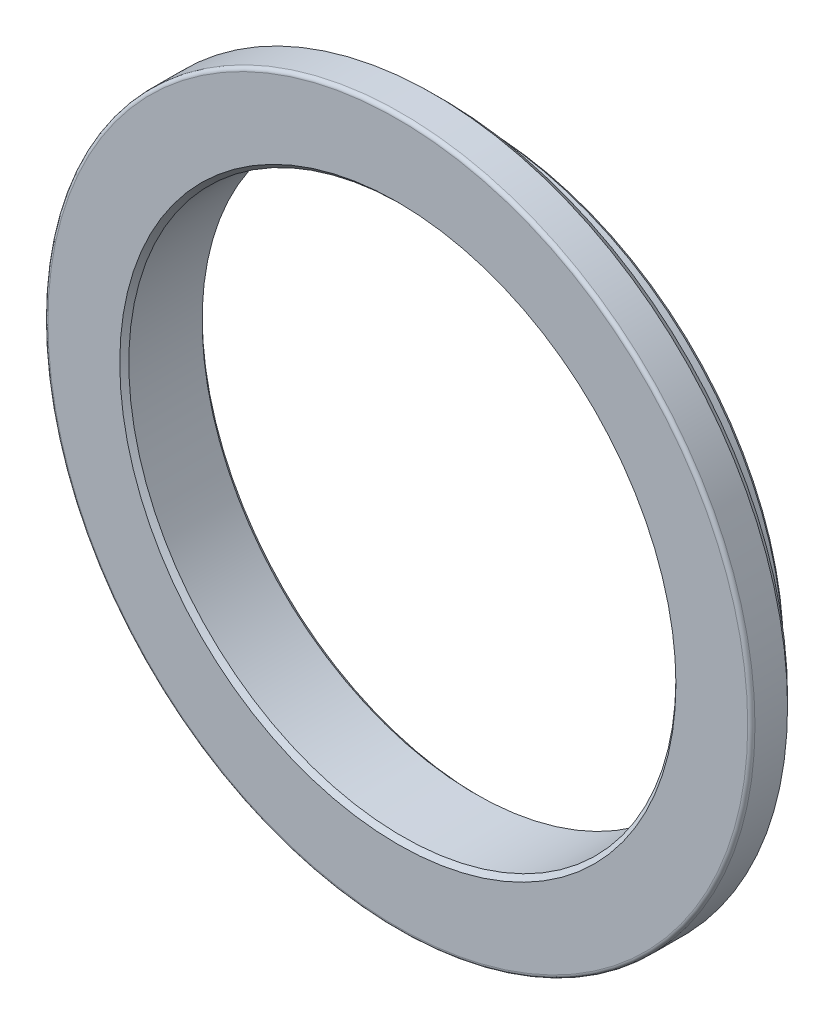
ISO-10303-21;
HEADER;
FILE_DESCRIPTION(('STEP AP214'),'2;1');
FILE_NAME('part.step','',(''),(''),'','','');
FILE_SCHEMA(('AUTOMOTIVE_DESIGN { 1 0 10303 214 1 1 1 1 }'));
ENDSEC;
DATA;
#1=APPLICATION_CONTEXT('core data for automotive mechanical design processes');
#2=APPLICATION_PROTOCOL_DEFINITION('international standard','automotive_design',2000,#1);
#3=PRODUCT_CONTEXT('',#1,'mechanical');
#4=PRODUCT('Part','Part','',(#3));
#5=PRODUCT_RELATED_PRODUCT_CATEGORY('part','',(#4));
#6=PRODUCT_DEFINITION_FORMATION('','',#4);
#7=PRODUCT_DEFINITION_CONTEXT('part definition',#1,'design');
#8=PRODUCT_DEFINITION('design','',#6,#7);
#9=PRODUCT_DEFINITION_SHAPE('','',#8);
#10=(LENGTH_UNIT() NAMED_UNIT(*) SI_UNIT(.MILLI.,.METRE.));
#11=(NAMED_UNIT(*) PLANE_ANGLE_UNIT() SI_UNIT($,.RADIAN.));
#12=(NAMED_UNIT(*) SI_UNIT($,.STERADIAN.) SOLID_ANGLE_UNIT());
#13=UNCERTAINTY_MEASURE_WITH_UNIT(LENGTH_MEASURE(1.E-05),#10,'distance_accuracy_value','');
#14=(GEOMETRIC_REPRESENTATION_CONTEXT(3) GLOBAL_UNCERTAINTY_ASSIGNED_CONTEXT((#13)) GLOBAL_UNIT_ASSIGNED_CONTEXT((#10,
#11,#12)) REPRESENTATION_CONTEXT('',''));
#15=CARTESIAN_POINT('',(0.,0.,0.));
#16=DIRECTION('',(0.,0.,1.));
#17=DIRECTION('',(1.,0.,0.));
#18=AXIS2_PLACEMENT_3D('',#15,#16,#17);
#19=CARTESIAN_POINT('',(0.,0.,-0.4));
#20=DIRECTION('',(0.,0.,1.));
#21=DIRECTION('',(1.,0.,0.));
#22=AXIS2_PLACEMENT_3D('',#19,#20,#21);
#23=TOROIDAL_SURFACE('',#22,38.66,0.399999999999999);
#24=CARTESIAN_POINT('',(0.,0.,0.));
#25=DIRECTION('',(0.,0.,1.));
#26=DIRECTION('',(1.,0.,0.));
#27=AXIS2_PLACEMENT_3D('',#24,#25,#26);
#28=CIRCLE('',#27,38.66);
#29=CARTESIAN_POINT('',(38.66,0.,0.));
#30=VERTEX_POINT('',#29);
#31=EDGE_CURVE('E77',#30,#30,#28,.T.);
#32=ORIENTED_EDGE('',*,*,#31,.F.);
#33=EDGE_LOOP('',(#32));
#34=FACE_BOUND('',#33,.T.);
#35=CARTESIAN_POINT('',(0.,0.,-0.4));
#36=DIRECTION('',(0.,0.,1.));
#37=DIRECTION('',(1.,0.,0.));
#38=AXIS2_PLACEMENT_3D('',#35,#36,#37);
#39=CIRCLE('',#38,39.06);
#40=CARTESIAN_POINT('',(39.06,0.,-0.4));
#41=VERTEX_POINT('',#40);
#42=EDGE_CURVE('E10',#41,#41,#39,.T.);
#43=ORIENTED_EDGE('',*,*,#42,.T.);
#44=EDGE_LOOP('',(#43));
#45=FACE_BOUND('',#44,.T.);
#46=ADVANCED_FACE('F37',(#34,#45),#23,.T.);
#47=CARTESIAN_POINT('',(0.,0.,0.));
#48=DIRECTION('',(0.,0.,1.));
#49=DIRECTION('',(1.,0.,0.));
#50=AXIS2_PLACEMENT_3D('',#47,#48,#49);
#51=CYLINDRICAL_SURFACE('',#50,39.06);
#52=ORIENTED_EDGE('',*,*,#42,.F.);
#53=EDGE_LOOP('',(#52));
#54=FACE_BOUND('',#53,.T.);
#55=CARTESIAN_POINT('',(0.,0.,-4.));
#56=DIRECTION('',(0.,0.,1.));
#57=DIRECTION('',(1.,0.,0.));
#58=AXIS2_PLACEMENT_3D('',#55,#56,#57);
#59=CIRCLE('',#58,39.06);
#60=CARTESIAN_POINT('',(39.06,0.,-4.));
#61=VERTEX_POINT('',#60);
#62=EDGE_CURVE('E43',#61,#61,#59,.T.);
#63=ORIENTED_EDGE('',*,*,#62,.T.);
#64=EDGE_LOOP('',(#63));
#65=FACE_BOUND('',#64,.T.);
#66=ADVANCED_FACE('F84',(#54,#65),#51,.T.);
#67=CARTESIAN_POINT('',(0.,0.,-5.));
#68=DIRECTION('',(0.,0.,1.));
#69=DIRECTION('',(1.,0.,0.));
#70=AXIS2_PLACEMENT_3D('',#67,#68,#69);
#71=CONICAL_SURFACE('',#70,38.06,0.785398163397449);
#72=ORIENTED_EDGE('',*,*,#62,.F.);
#73=EDGE_LOOP('',(#72));
#74=FACE_BOUND('',#73,.T.);
#75=CARTESIAN_POINT('',(0.,0.,-5.));
#76=DIRECTION('',(0.,0.,1.));
#77=DIRECTION('',(1.,0.,0.));
#78=AXIS2_PLACEMENT_3D('',#75,#76,#77);
#79=CIRCLE('',#78,38.06);
#80=CARTESIAN_POINT('',(38.06,0.,-5.));
#81=VERTEX_POINT('',#80);
#82=EDGE_CURVE('E47',#81,#81,#79,.T.);
#83=ORIENTED_EDGE('',*,*,#82,.T.);
#84=EDGE_LOOP('',(#83));
#85=FACE_BOUND('',#84,.T.);
#86=ADVANCED_FACE('F88',(#74,#85),#71,.T.);
#87=CARTESIAN_POINT('',(0.,38.06,-5.));
#88=DIRECTION('',(0.,0.,1.));
#89=DIRECTION('',(1.,0.,0.));
#90=AXIS2_PLACEMENT_3D('',#87,#88,#89);
#91=PLANE('',#90);
#92=ORIENTED_EDGE('',*,*,#82,.F.);
#93=EDGE_LOOP('',(#92));
#94=FACE_BOUND('',#93,.T.);
#95=CARTESIAN_POINT('',(0.,0.,-5.));
#96=DIRECTION('',(0.,0.,1.));
#97=DIRECTION('',(1.,0.,0.));
#98=AXIS2_PLACEMENT_3D('',#95,#96,#97);
#99=CIRCLE('',#98,34.4);
#100=CARTESIAN_POINT('',(34.4,0.,-5.));
#101=VERTEX_POINT('',#100);
#102=EDGE_CURVE('E51',#101,#101,#99,.T.);
#103=ORIENTED_EDGE('',*,*,#102,.T.);
#104=EDGE_LOOP('',(#103));
#105=FACE_BOUND('',#104,.T.);
#106=ADVANCED_FACE('F93',(#94,#105),#91,.F.);
#107=CARTESIAN_POINT('',(0.,0.,-5.4));
#108=DIRECTION('',(0.,0.,1.));
#109=DIRECTION('',(1.,0.,0.));
#110=AXIS2_PLACEMENT_3D('',#107,#108,#109);
#111=TOROIDAL_SURFACE('',#110,34.4,0.399999999999999);
#112=ORIENTED_EDGE('',*,*,#102,.F.);
#113=EDGE_LOOP('',(#112));
#114=FACE_BOUND('',#113,.T.);
#115=CARTESIAN_POINT('',(0.,0.,-5.4));
#116=DIRECTION('',(0.,0.,1.));
#117=DIRECTION('',(1.,0.,0.));
#118=AXIS2_PLACEMENT_3D('',#115,#116,#117);
#119=CIRCLE('',#118,34.);
#120=CARTESIAN_POINT('',(34.,0.,-5.4));
#121=VERTEX_POINT('',#120);
#122=EDGE_CURVE('E56',#121,#121,#119,.T.);
#123=ORIENTED_EDGE('',*,*,#122,.T.);
#124=EDGE_LOOP('',(#123));
#125=FACE_BOUND('',#124,.T.);
#126=ADVANCED_FACE('F99',(#114,#125),#111,.F.);
#127=CARTESIAN_POINT('',(0.,0.,0.));
#128=DIRECTION('',(0.,0.,1.));
#129=DIRECTION('',(1.,0.,0.));
#130=AXIS2_PLACEMENT_3D('',#127,#128,#129);
#131=CYLINDRICAL_SURFACE('',#130,34.);
#132=ORIENTED_EDGE('',*,*,#122,.F.);
#133=EDGE_LOOP('',(#132));
#134=FACE_BOUND('',#133,.T.);
#135=CARTESIAN_POINT('',(0.,0.,-8.6));
#136=DIRECTION('',(0.,0.,1.));
#137=DIRECTION('',(1.,0.,0.));
#138=AXIS2_PLACEMENT_3D('',#135,#136,#137);
#139=CIRCLE('',#138,34.);
#140=CARTESIAN_POINT('',(34.,0.,-8.6));
#141=VERTEX_POINT('',#140);
#142=EDGE_CURVE('E59',#141,#141,#139,.T.);
#143=ORIENTED_EDGE('',*,*,#142,.T.);
#144=EDGE_LOOP('',(#143));
#145=FACE_BOUND('',#144,.T.);
#146=ADVANCED_FACE('F103',(#134,#145),#131,.T.);
#147=CARTESIAN_POINT('',(0.,0.,-9.1));
#148=DIRECTION('',(0.,0.,1.));
#149=DIRECTION('',(1.,0.,0.));
#150=AXIS2_PLACEMENT_3D('',#147,#148,#149);
#151=CONICAL_SURFACE('',#150,33.5,0.785398163397447);
#152=ORIENTED_EDGE('',*,*,#142,.F.);
#153=EDGE_LOOP('',(#152));
#154=FACE_BOUND('',#153,.T.);
#155=CARTESIAN_POINT('',(0.,0.,-9.1));
#156=DIRECTION('',(0.,0.,1.));
#157=DIRECTION('',(1.,0.,0.));
#158=AXIS2_PLACEMENT_3D('',#155,#156,#157);
#159=CIRCLE('',#158,33.5);
#160=CARTESIAN_POINT('',(33.5,0.,-9.1));
#161=VERTEX_POINT('',#160);
#162=EDGE_CURVE('E62',#161,#161,#159,.T.);
#163=ORIENTED_EDGE('',*,*,#162,.T.);
#164=EDGE_LOOP('',(#163));
#165=FACE_BOUND('',#164,.T.);
#166=ADVANCED_FACE('F107',(#154,#165),#151,.T.);
#167=CARTESIAN_POINT('',(0.,33.5,-9.1));
#168=DIRECTION('',(0.,0.,1.));
#169=DIRECTION('',(1.,0.,0.));
#170=AXIS2_PLACEMENT_3D('',#167,#168,#169);
#171=PLANE('',#170);
#172=ORIENTED_EDGE('',*,*,#162,.F.);
#173=EDGE_LOOP('',(#172));
#174=FACE_BOUND('',#173,.T.);
#175=CARTESIAN_POINT('',(0.,0.,-9.1));
#176=DIRECTION('',(0.,0.,1.));
#177=DIRECTION('',(1.,0.,0.));
#178=AXIS2_PLACEMENT_3D('',#175,#176,#177);
#179=CIRCLE('',#178,30.725);
#180=CARTESIAN_POINT('',(30.725,0.,-9.1));
#181=VERTEX_POINT('',#180);
#182=EDGE_CURVE('E65',#181,#181,#179,.T.);
#183=ORIENTED_EDGE('',*,*,#182,.T.);
#184=EDGE_LOOP('',(#183));
#185=FACE_BOUND('',#184,.T.);
#186=ADVANCED_FACE('F111',(#174,#185),#171,.F.);
#187=CARTESIAN_POINT('',(0.,0.,-8.6));
#188=DIRECTION('',(0.,0.,-1.));
#189=DIRECTION('',(-1.,0.,0.));
#190=AXIS2_PLACEMENT_3D('',#187,#188,#189);
#191=CONICAL_SURFACE('',#190,30.225,0.78539816339745);
#192=ORIENTED_EDGE('',*,*,#182,.F.);
#193=EDGE_LOOP('',(#192));
#194=FACE_BOUND('',#193,.T.);
#195=CARTESIAN_POINT('',(0.,0.,-8.6));
#196=DIRECTION('',(0.,0.,1.));
#197=DIRECTION('',(1.,0.,0.));
#198=AXIS2_PLACEMENT_3D('',#195,#196,#197);
#199=CIRCLE('',#198,30.225);
#200=CARTESIAN_POINT('',(30.225,0.,-8.6));
#201=VERTEX_POINT('',#200);
#202=EDGE_CURVE('E68',#201,#201,#199,.T.);
#203=ORIENTED_EDGE('',*,*,#202,.T.);
#204=EDGE_LOOP('',(#203));
#205=FACE_BOUND('',#204,.T.);
#206=ADVANCED_FACE('F115',(#194,#205),#191,.F.);
#207=CARTESIAN_POINT('',(0.,0.,0.));
#208=DIRECTION('',(0.,0.,1.));
#209=DIRECTION('',(1.,0.,0.));
#210=AXIS2_PLACEMENT_3D('',#207,#208,#209);
#211=CYLINDRICAL_SURFACE('',#210,30.225);
#212=ORIENTED_EDGE('',*,*,#202,.F.);
#213=EDGE_LOOP('',(#212));
#214=FACE_BOUND('',#213,.T.);
#215=CARTESIAN_POINT('',(0.,0.,-0.500000000000001));
#216=DIRECTION('',(0.,0.,1.));
#217=DIRECTION('',(1.,0.,0.));
#218=AXIS2_PLACEMENT_3D('',#215,#216,#217);
#219=CIRCLE('',#218,30.225);
#220=CARTESIAN_POINT('',(30.225,0.,-0.500000000000001));
#221=VERTEX_POINT('',#220);
#222=EDGE_CURVE('E71',#221,#221,#219,.T.);
#223=ORIENTED_EDGE('',*,*,#222,.T.);
#224=EDGE_LOOP('',(#223));
#225=FACE_BOUND('',#224,.T.);
#226=ADVANCED_FACE('F119',(#214,#225),#211,.F.);
#227=CARTESIAN_POINT('',(0.,0.,0.));
#228=DIRECTION('',(0.,0.,1.));
#229=DIRECTION('',(1.,0.,0.));
#230=AXIS2_PLACEMENT_3D('',#227,#228,#229);
#231=CONICAL_SURFACE('',#230,30.725,0.785398163397449);
#232=ORIENTED_EDGE('',*,*,#222,.F.);
#233=EDGE_LOOP('',(#232));
#234=FACE_BOUND('',#233,.T.);
#235=CARTESIAN_POINT('',(0.,0.,0.));
#236=DIRECTION('',(0.,0.,1.));
#237=DIRECTION('',(1.,0.,0.));
#238=AXIS2_PLACEMENT_3D('',#235,#236,#237);
#239=CIRCLE('',#238,30.725);
#240=CARTESIAN_POINT('',(30.725,0.,0.));
#241=VERTEX_POINT('',#240);
#242=EDGE_CURVE('E74',#241,#241,#239,.T.);
#243=ORIENTED_EDGE('',*,*,#242,.T.);
#244=EDGE_LOOP('',(#243));
#245=FACE_BOUND('',#244,.T.);
#246=ADVANCED_FACE('F123',(#234,#245),#231,.F.);
#247=CARTESIAN_POINT('',(0.,38.66,0.));
#248=DIRECTION('',(0.,0.,-1.));
#249=DIRECTION('',(-1.,0.,0.));
#250=AXIS2_PLACEMENT_3D('',#247,#248,#249);
#251=PLANE('',#250);
#252=ORIENTED_EDGE('',*,*,#242,.F.);
#253=EDGE_LOOP('',(#252));
#254=FACE_BOUND('',#253,.T.);
#255=ORIENTED_EDGE('',*,*,#31,.T.);
#256=EDGE_LOOP('',(#255));
#257=FACE_BOUND('',#256,.T.);
#258=ADVANCED_FACE('F81',(#254,#257),#251,.F.);
#259=CLOSED_SHELL('',(#46,#66,#86,#106,#126,#146,#166,#186,#206,#226,#246,#258));
#260=MANIFOLD_SOLID_BREP('B2',#259);
#261=ADVANCED_BREP_SHAPE_REPRESENTATION('',(#18,#260),#14);
#262=SHAPE_DEFINITION_REPRESENTATION(#9,#261);
ENDSEC;
END-ISO-10303-21;
